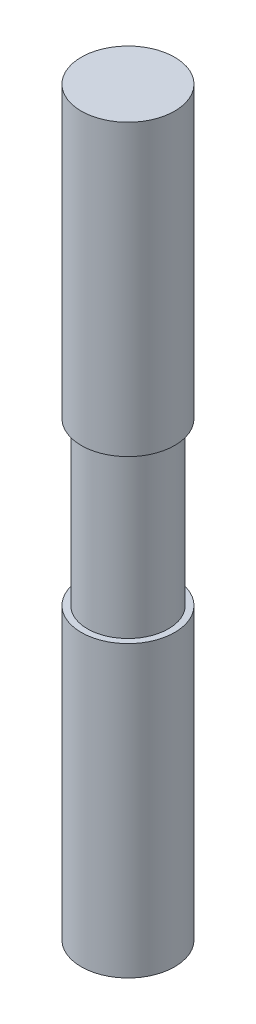
ISO-10303-21;
HEADER;
FILE_DESCRIPTION(('STEP AP214'),'2;1');
FILE_NAME('part.step','',(''),(''),'','','');
FILE_SCHEMA(('AUTOMOTIVE_DESIGN { 1 0 10303 214 1 1 1 1 }'));
ENDSEC;
DATA;
#1=APPLICATION_CONTEXT('core data for automotive mechanical design processes');
#2=APPLICATION_PROTOCOL_DEFINITION('international standard','automotive_design',2000,#1);
#3=PRODUCT_CONTEXT('',#1,'mechanical');
#4=PRODUCT('Part','Part','',(#3));
#5=PRODUCT_RELATED_PRODUCT_CATEGORY('part','',(#4));
#6=PRODUCT_DEFINITION_FORMATION('','',#4);
#7=PRODUCT_DEFINITION_CONTEXT('part definition',#1,'design');
#8=PRODUCT_DEFINITION('design','',#6,#7);
#9=PRODUCT_DEFINITION_SHAPE('','',#8);
#10=(LENGTH_UNIT() NAMED_UNIT(*) SI_UNIT(.MILLI.,.METRE.));
#11=(NAMED_UNIT(*) PLANE_ANGLE_UNIT() SI_UNIT($,.RADIAN.));
#12=(NAMED_UNIT(*) SI_UNIT($,.STERADIAN.) SOLID_ANGLE_UNIT());
#13=UNCERTAINTY_MEASURE_WITH_UNIT(LENGTH_MEASURE(1.E-05),#10,'distance_accuracy_value','');
#14=(GEOMETRIC_REPRESENTATION_CONTEXT(3) GLOBAL_UNCERTAINTY_ASSIGNED_CONTEXT((#13)) GLOBAL_UNIT_ASSIGNED_CONTEXT((#10,
#11,#12)) REPRESENTATION_CONTEXT('',''));
#15=CARTESIAN_POINT('',(0.,0.,0.));
#16=DIRECTION('',(0.,0.,1.));
#17=DIRECTION('',(1.,0.,0.));
#18=AXIS2_PLACEMENT_3D('',#15,#16,#17);
#19=CARTESIAN_POINT('',(0.,75.565,0.));
#20=DIRECTION('',(0.,-1.,0.));
#21=DIRECTION('',(0.,0.,-1.));
#22=AXIS2_PLACEMENT_3D('',#19,#20,#21);
#23=CYLINDRICAL_SURFACE('',#22,4.7625);
#24=CARTESIAN_POINT('',(0.,46.0375,0.));
#25=DIRECTION('',(0.,1.,0.));
#26=DIRECTION('',(0.,0.,1.));
#27=AXIS2_PLACEMENT_3D('',#24,#25,#26);
#28=CIRCLE('',#27,4.7625);
#29=CARTESIAN_POINT('',(0.,46.0375,4.7625));
#30=VERTEX_POINT('',#29);
#31=EDGE_CURVE('E49',#30,#30,#28,.T.);
#32=ORIENTED_EDGE('',*,*,#31,.T.);
#33=EDGE_LOOP('',(#32));
#34=FACE_BOUND('',#33,.T.);
#35=CARTESIAN_POINT('',(0.,75.565,0.));
#36=DIRECTION('',(0.,1.,0.));
#37=DIRECTION('',(0.,0.,1.));
#38=AXIS2_PLACEMENT_3D('',#35,#36,#37);
#39=CIRCLE('',#38,4.7625);
#40=CARTESIAN_POINT('',(0.,75.565,4.7625));
#41=VERTEX_POINT('',#40);
#42=EDGE_CURVE('E11',#41,#41,#39,.T.);
#43=ORIENTED_EDGE('',*,*,#42,.F.);
#44=EDGE_LOOP('',(#43));
#45=FACE_BOUND('',#44,.T.);
#46=ADVANCED_FACE('F46',(#34,#45),#23,.T.);
#47=CARTESIAN_POINT('',(0.,75.565,0.));
#48=DIRECTION('',(0.,1.,0.));
#49=DIRECTION('',(0.,0.,1.));
#50=AXIS2_PLACEMENT_3D('',#47,#48,#49);
#51=PLANE('',#50);
#52=ORIENTED_EDGE('',*,*,#42,.T.);
#53=EDGE_LOOP('',(#52));
#54=FACE_BOUND('',#53,.T.);
#55=ADVANCED_FACE('F87',(#54),#51,.T.);
#56=CARTESIAN_POINT('',(0.,46.0375,0.));
#57=DIRECTION('',(0.,1.,0.));
#58=DIRECTION('',(0.,0.,1.));
#59=AXIS2_PLACEMENT_3D('',#56,#57,#58);
#60=PLANE('',#59);
#61=CARTESIAN_POINT('',(0.,46.0375,0.));
#62=DIRECTION('',(0.,1.,0.));
#63=DIRECTION('',(0.,0.,1.));
#64=AXIS2_PLACEMENT_3D('',#61,#62,#63);
#65=CIRCLE('',#64,4.1275);
#66=CARTESIAN_POINT('',(0.,46.0375,4.1275));
#67=VERTEX_POINT('',#66);
#68=EDGE_CURVE('E60',#67,#67,#65,.T.);
#69=ORIENTED_EDGE('',*,*,#68,.T.);
#70=EDGE_LOOP('',(#69));
#71=FACE_BOUND('',#70,.T.);
#72=ORIENTED_EDGE('',*,*,#31,.F.);
#73=EDGE_LOOP('',(#72));
#74=FACE_BOUND('',#73,.T.);
#75=ADVANCED_FACE('F78',(#71,#74),#60,.F.);
#76=CARTESIAN_POINT('',(0.,29.5275,0.));
#77=DIRECTION('',(0.,1.,0.));
#78=DIRECTION('',(0.,0.,1.));
#79=AXIS2_PLACEMENT_3D('',#76,#77,#78);
#80=PLANE('',#79);
#81=CARTESIAN_POINT('',(0.,29.5275,0.));
#82=DIRECTION('',(0.,1.,0.));
#83=DIRECTION('',(0.,0.,1.));
#84=AXIS2_PLACEMENT_3D('',#81,#82,#83);
#85=CIRCLE('',#84,4.1275);
#86=CARTESIAN_POINT('',(0.,29.5275,4.1275));
#87=VERTEX_POINT('',#86);
#88=EDGE_CURVE('E68',#87,#87,#85,.T.);
#89=ORIENTED_EDGE('',*,*,#88,.F.);
#90=EDGE_LOOP('',(#89));
#91=FACE_BOUND('',#90,.T.);
#92=CARTESIAN_POINT('',(0.,29.5275,0.));
#93=DIRECTION('',(0.,1.,0.));
#94=DIRECTION('',(0.,0.,1.));
#95=AXIS2_PLACEMENT_3D('',#92,#93,#94);
#96=CIRCLE('',#95,4.7625);
#97=CARTESIAN_POINT('',(0.,29.5275,4.7625));
#98=VERTEX_POINT('',#97);
#99=EDGE_CURVE('E62',#98,#98,#96,.T.);
#100=ORIENTED_EDGE('',*,*,#99,.T.);
#101=EDGE_LOOP('',(#100));
#102=FACE_BOUND('',#101,.T.);
#103=ADVANCED_FACE('F76',(#91,#102),#80,.T.);
#104=CARTESIAN_POINT('',(0.,46.0375,0.));
#105=DIRECTION('',(0.,-1.,0.));
#106=DIRECTION('',(0.,0.,-1.));
#107=AXIS2_PLACEMENT_3D('',#104,#105,#106);
#108=CYLINDRICAL_SURFACE('',#107,4.1275);
#109=ORIENTED_EDGE('',*,*,#68,.F.);
#110=EDGE_LOOP('',(#109));
#111=FACE_BOUND('',#110,.T.);
#112=ORIENTED_EDGE('',*,*,#88,.T.);
#113=EDGE_LOOP('',(#112));
#114=FACE_BOUND('',#113,.T.);
#115=ADVANCED_FACE('F74',(#111,#114),#108,.T.);
#116=CARTESIAN_POINT('',(0.,0.,0.));
#117=DIRECTION('',(0.,1.,0.));
#118=DIRECTION('',(0.,0.,1.));
#119=AXIS2_PLACEMENT_3D('',#116,#117,#118);
#120=PLANE('',#119);
#121=CARTESIAN_POINT('',(0.,0.,0.));
#122=DIRECTION('',(0.,1.,0.));
#123=DIRECTION('',(0.,0.,1.));
#124=AXIS2_PLACEMENT_3D('',#121,#122,#123);
#125=CIRCLE('',#124,4.7625);
#126=CARTESIAN_POINT('',(0.,0.,4.7625));
#127=VERTEX_POINT('',#126);
#128=EDGE_CURVE('E53',#127,#127,#125,.T.);
#129=ORIENTED_EDGE('',*,*,#128,.F.);
#130=EDGE_LOOP('',(#129));
#131=FACE_BOUND('',#130,.T.);
#132=ADVANCED_FACE('F84',(#131),#120,.F.);
#133=ORIENTED_EDGE('',*,*,#128,.T.);
#134=EDGE_LOOP('',(#133));
#135=FACE_BOUND('',#134,.T.);
#136=ORIENTED_EDGE('',*,*,#99,.F.);
#137=EDGE_LOOP('',(#136));
#138=FACE_BOUND('',#137,.T.);
#139=ADVANCED_FACE('F91',(#135,#138),#23,.T.);
#140=CLOSED_SHELL('',(#46,#55,#75,#103,#115,#132,#139));
#141=MANIFOLD_SOLID_BREP('B2',#140);
#142=ADVANCED_BREP_SHAPE_REPRESENTATION('',(#18,#141),#14);
#143=SHAPE_DEFINITION_REPRESENTATION(#9,#142);
ENDSEC;
END-ISO-10303-21;
